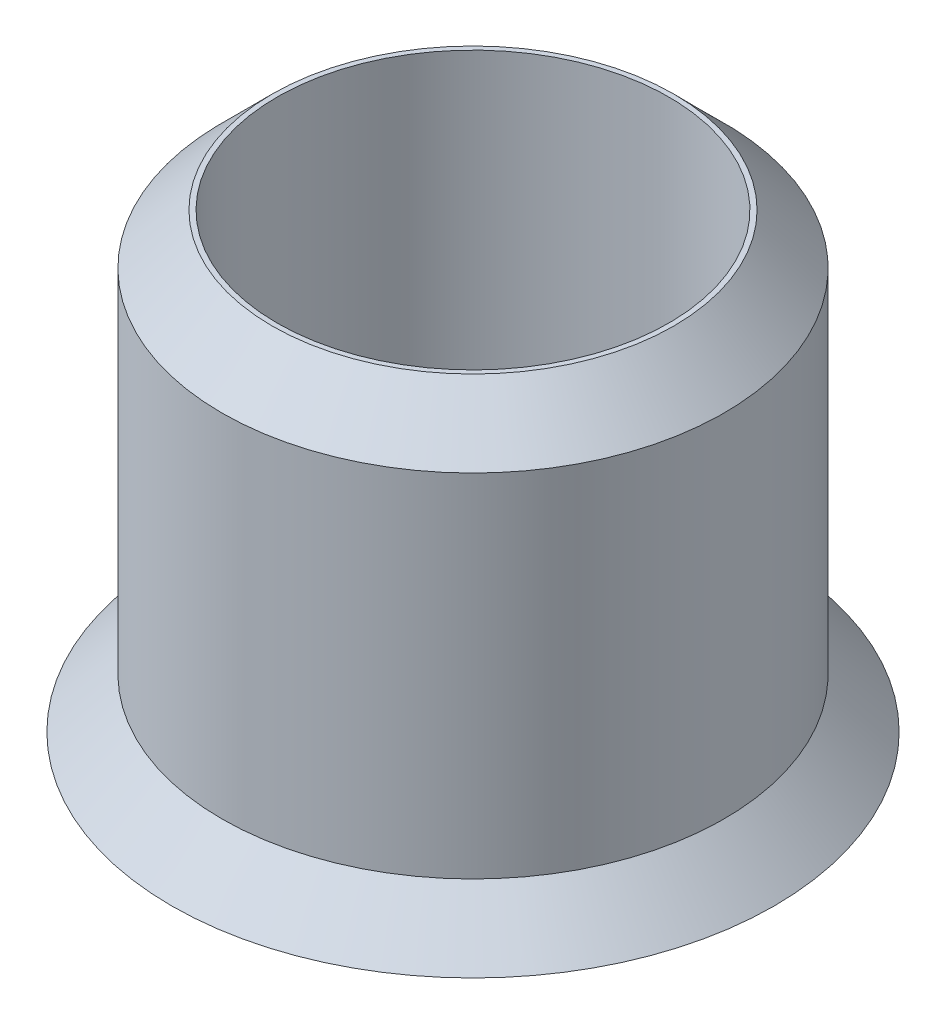
ISO-10303-21;
HEADER;
FILE_DESCRIPTION(('STEP AP214'),'2;1');
FILE_NAME('part.step','',(''),(''),'','','');
FILE_SCHEMA(('AUTOMOTIVE_DESIGN { 1 0 10303 214 1 1 1 1 }'));
ENDSEC;
DATA;
#1=APPLICATION_CONTEXT('core data for automotive mechanical design processes');
#2=APPLICATION_PROTOCOL_DEFINITION('international standard','automotive_design',2000,#1);
#3=PRODUCT_CONTEXT('',#1,'mechanical');
#4=PRODUCT('Part','Part','',(#3));
#5=PRODUCT_RELATED_PRODUCT_CATEGORY('part','',(#4));
#6=PRODUCT_DEFINITION_FORMATION('','',#4);
#7=PRODUCT_DEFINITION_CONTEXT('part definition',#1,'design');
#8=PRODUCT_DEFINITION('design','',#6,#7);
#9=PRODUCT_DEFINITION_SHAPE('','',#8);
#10=(LENGTH_UNIT() NAMED_UNIT(*) SI_UNIT(.MILLI.,.METRE.));
#11=(NAMED_UNIT(*) PLANE_ANGLE_UNIT() SI_UNIT($,.RADIAN.));
#12=(NAMED_UNIT(*) SI_UNIT($,.STERADIAN.) SOLID_ANGLE_UNIT());
#13=UNCERTAINTY_MEASURE_WITH_UNIT(LENGTH_MEASURE(1.E-05),#10,'distance_accuracy_value','');
#14=(GEOMETRIC_REPRESENTATION_CONTEXT(3) GLOBAL_UNCERTAINTY_ASSIGNED_CONTEXT((#13)) GLOBAL_UNIT_ASSIGNED_CONTEXT((#10,
#11,#12)) REPRESENTATION_CONTEXT('',''));
#15=CARTESIAN_POINT('',(0.,0.,0.));
#16=DIRECTION('',(0.,0.,1.));
#17=DIRECTION('',(1.,0.,0.));
#18=AXIS2_PLACEMENT_3D('',#15,#16,#17);
#19=CARTESIAN_POINT('',(0.,0.,0.));
#20=DIRECTION('',(0.,1.,0.));
#21=DIRECTION('',(0.,0.,1.));
#22=AXIS2_PLACEMENT_3D('',#19,#20,#21);
#23=PLANE('',#22);
#24=CARTESIAN_POINT('',(0.,0.,0.));
#25=DIRECTION('',(0.,1.,0.));
#26=DIRECTION('',(0.,0.,1.));
#27=AXIS2_PLACEMENT_3D('',#24,#25,#26);
#28=CIRCLE('',#27,6.);
#29=CARTESIAN_POINT('',(0.,0.,6.));
#30=VERTEX_POINT('',#29);
#31=EDGE_CURVE('E48',#30,#30,#28,.T.);
#32=ORIENTED_EDGE('',*,*,#31,.F.);
#33=EDGE_LOOP('',(#32));
#34=FACE_BOUND('',#33,.T.);
#35=ADVANCED_FACE('F33',(#34),#23,.F.);
#36=CARTESIAN_POINT('',(0.,9.,0.));
#37=DIRECTION('',(0.,1.,0.));
#38=DIRECTION('',(0.,0.,1.));
#39=AXIS2_PLACEMENT_3D('',#36,#37,#38);
#40=PLANE('',#39);
#41=CARTESIAN_POINT('',(0.,9.,0.));
#42=DIRECTION('',(0.,1.,0.));
#43=DIRECTION('',(0.,0.,1.));
#44=AXIS2_PLACEMENT_3D('',#41,#42,#43);
#45=CIRCLE('',#44,4.);
#46=CARTESIAN_POINT('',(0.,9.,4.));
#47=VERTEX_POINT('',#46);
#48=EDGE_CURVE('E40',#47,#47,#45,.T.);
#49=ORIENTED_EDGE('',*,*,#48,.T.);
#50=EDGE_LOOP('',(#49));
#51=FACE_BOUND('',#50,.T.);
#52=CARTESIAN_POINT('',(0.,9.,0.));
#53=DIRECTION('',(0.,1.,0.));
#54=DIRECTION('',(0.,0.,1.));
#55=AXIS2_PLACEMENT_3D('',#52,#53,#54);
#56=CIRCLE('',#55,3.9);
#57=CARTESIAN_POINT('',(0.,9.,3.9));
#58=VERTEX_POINT('',#57);
#59=EDGE_CURVE('E56',#58,#58,#56,.T.);
#60=ORIENTED_EDGE('',*,*,#59,.F.);
#61=EDGE_LOOP('',(#60));
#62=FACE_BOUND('',#61,.T.);
#63=ADVANCED_FACE('F63',(#51,#62),#40,.T.);
#64=CARTESIAN_POINT('',(0.,9.,0.));
#65=DIRECTION('',(0.,-1.,0.));
#66=DIRECTION('',(0.,0.,-1.));
#67=AXIS2_PLACEMENT_3D('',#64,#65,#66);
#68=CYLINDRICAL_SURFACE('',#67,5.);
#69=CARTESIAN_POINT('',(0.,8.,0.));
#70=DIRECTION('',(0.,1.,0.));
#71=DIRECTION('',(0.,0.,1.));
#72=AXIS2_PLACEMENT_3D('',#69,#70,#71);
#73=CIRCLE('',#72,5.);
#74=CARTESIAN_POINT('',(0.,8.,5.));
#75=VERTEX_POINT('',#74);
#76=EDGE_CURVE('E10',#75,#75,#73,.F.);
#77=ORIENTED_EDGE('',*,*,#76,.T.);
#78=EDGE_LOOP('',(#77));
#79=FACE_BOUND('',#78,.T.);
#80=CARTESIAN_POINT('',(0.,1.,0.));
#81=DIRECTION('',(0.,1.,0.));
#82=DIRECTION('',(0.,0.,1.));
#83=AXIS2_PLACEMENT_3D('',#80,#81,#82);
#84=CIRCLE('',#83,5.);
#85=CARTESIAN_POINT('',(0.,1.,5.));
#86=VERTEX_POINT('',#85);
#87=EDGE_CURVE('E53',#86,#86,#84,.T.);
#88=ORIENTED_EDGE('',*,*,#87,.T.);
#89=EDGE_LOOP('',(#88));
#90=FACE_BOUND('',#89,.T.);
#91=ADVANCED_FACE('F65',(#79,#90),#68,.T.);
#92=CARTESIAN_POINT('',(0.,9.,0.));
#93=DIRECTION('',(0.,-1.,0.));
#94=DIRECTION('',(0.,0.,-1.));
#95=AXIS2_PLACEMENT_3D('',#92,#93,#94);
#96=CYLINDRICAL_SURFACE('',#95,3.9);
#97=ORIENTED_EDGE('',*,*,#59,.T.);
#98=EDGE_LOOP('',(#97));
#99=FACE_BOUND('',#98,.T.);
#100=CARTESIAN_POINT('',(0.,1.,0.));
#101=DIRECTION('',(0.,1.,0.));
#102=DIRECTION('',(0.,0.,1.));
#103=AXIS2_PLACEMENT_3D('',#100,#101,#102);
#104=CIRCLE('',#103,3.9);
#105=CARTESIAN_POINT('',(0.,1.,3.9));
#106=VERTEX_POINT('',#105);
#107=EDGE_CURVE('E44',#106,#106,#104,.F.);
#108=ORIENTED_EDGE('',*,*,#107,.T.);
#109=EDGE_LOOP('',(#108));
#110=FACE_BOUND('',#109,.T.);
#111=ADVANCED_FACE('F60',(#99,#110),#96,.F.);
#112=CARTESIAN_POINT('',(0.,1.,0.));
#113=DIRECTION('',(0.,1.,0.));
#114=DIRECTION('',(0.,0.,1.));
#115=AXIS2_PLACEMENT_3D('',#112,#113,#114);
#116=PLANE('',#115);
#117=ORIENTED_EDGE('',*,*,#107,.F.);
#118=EDGE_LOOP('',(#117));
#119=FACE_BOUND('',#118,.T.);
#120=ADVANCED_FACE('F76',(#119),#116,.T.);
#121=CARTESIAN_POINT('',(0.,1.,0.));
#122=DIRECTION('',(0.,-1.,0.));
#123=DIRECTION('',(0.,0.,-1.));
#124=AXIS2_PLACEMENT_3D('',#121,#122,#123);
#125=CONICAL_SURFACE('',#124,5.,0.785398163397447);
#126=ORIENTED_EDGE('',*,*,#31,.T.);
#127=EDGE_LOOP('',(#126));
#128=FACE_BOUND('',#127,.T.);
#129=ORIENTED_EDGE('',*,*,#87,.F.);
#130=EDGE_LOOP('',(#129));
#131=FACE_BOUND('',#130,.T.);
#132=ADVANCED_FACE('F78',(#128,#131),#125,.T.);
#133=CARTESIAN_POINT('',(0.,9.,0.));
#134=DIRECTION('',(0.,-1.,0.));
#135=DIRECTION('',(0.,0.,-1.));
#136=AXIS2_PLACEMENT_3D('',#133,#134,#135);
#137=CONICAL_SURFACE('',#136,4.,0.785398163397446);
#138=ORIENTED_EDGE('',*,*,#76,.F.);
#139=EDGE_LOOP('',(#138));
#140=FACE_BOUND('',#139,.T.);
#141=ORIENTED_EDGE('',*,*,#48,.F.);
#142=EDGE_LOOP('',(#141));
#143=FACE_BOUND('',#142,.T.);
#144=ADVANCED_FACE('F35',(#140,#143),#137,.T.);
#145=CLOSED_SHELL('',(#35,#63,#91,#111,#120,#132,#144));
#146=MANIFOLD_SOLID_BREP('B2',#145);
#147=ADVANCED_BREP_SHAPE_REPRESENTATION('',(#18,#146),#14);
#148=SHAPE_DEFINITION_REPRESENTATION(#9,#147);
ENDSEC;
END-ISO-10303-21;
